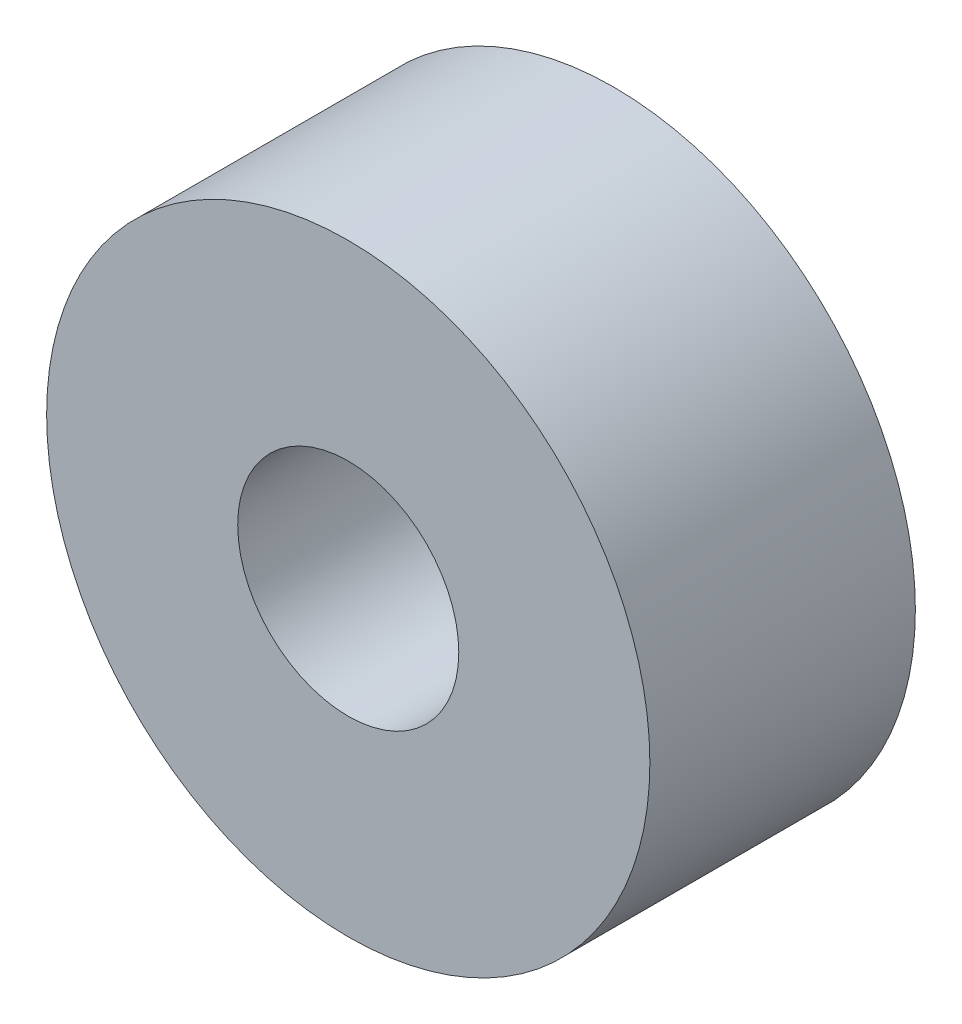
ISO-10303-21;
HEADER;
FILE_DESCRIPTION(('STEP AP214'),'2;1');
FILE_NAME('part.step','',(''),(''),'','','');
FILE_SCHEMA(('AUTOMOTIVE_DESIGN { 1 0 10303 214 1 1 1 1 }'));
ENDSEC;
DATA;
#1=APPLICATION_CONTEXT('core data for automotive mechanical design processes');
#2=APPLICATION_PROTOCOL_DEFINITION('international standard','automotive_design',2000,#1);
#3=PRODUCT_CONTEXT('',#1,'mechanical');
#4=PRODUCT('Part','Part','',(#3));
#5=PRODUCT_RELATED_PRODUCT_CATEGORY('part','',(#4));
#6=PRODUCT_DEFINITION_FORMATION('','',#4);
#7=PRODUCT_DEFINITION_CONTEXT('part definition',#1,'design');
#8=PRODUCT_DEFINITION('design','',#6,#7);
#9=PRODUCT_DEFINITION_SHAPE('','',#8);
#10=(LENGTH_UNIT() NAMED_UNIT(*) SI_UNIT(.MILLI.,.METRE.));
#11=(NAMED_UNIT(*) PLANE_ANGLE_UNIT() SI_UNIT($,.RADIAN.));
#12=(NAMED_UNIT(*) SI_UNIT($,.STERADIAN.) SOLID_ANGLE_UNIT());
#13=UNCERTAINTY_MEASURE_WITH_UNIT(LENGTH_MEASURE(1.E-05),#10,'distance_accuracy_value','');
#14=(GEOMETRIC_REPRESENTATION_CONTEXT(3) GLOBAL_UNCERTAINTY_ASSIGNED_CONTEXT((#13)) GLOBAL_UNIT_ASSIGNED_CONTEXT((#10,
#11,#12)) REPRESENTATION_CONTEXT('',''));
#15=CARTESIAN_POINT('',(0.,0.,0.));
#16=DIRECTION('',(0.,0.,1.));
#17=DIRECTION('',(1.,0.,0.));
#18=AXIS2_PLACEMENT_3D('',#15,#16,#17);
#19=CARTESIAN_POINT('',(0.,0.,7.35));
#20=DIRECTION('',(0.,0.,-1.));
#21=DIRECTION('',(-1.,0.,0.));
#22=AXIS2_PLACEMENT_3D('',#19,#20,#21);
#23=CYLINDRICAL_SURFACE('',#22,8.35);
#24=CARTESIAN_POINT('',(0.,0.,7.35));
#25=DIRECTION('',(0.,0.,1.));
#26=DIRECTION('',(1.,0.,0.));
#27=AXIS2_PLACEMENT_3D('',#24,#25,#26);
#28=CIRCLE('',#27,8.35);
#29=CARTESIAN_POINT('',(8.35,0.,7.35));
#30=VERTEX_POINT('',#29);
#31=EDGE_CURVE('E10',#30,#30,#28,.T.);
#32=ORIENTED_EDGE('',*,*,#31,.F.);
#33=EDGE_LOOP('',(#32));
#34=FACE_BOUND('',#33,.T.);
#35=CARTESIAN_POINT('',(0.,0.,0.));
#36=DIRECTION('',(0.,0.,1.));
#37=DIRECTION('',(1.,0.,0.));
#38=AXIS2_PLACEMENT_3D('',#35,#36,#37);
#39=CIRCLE('',#38,8.35);
#40=CARTESIAN_POINT('',(8.35,0.,0.));
#41=VERTEX_POINT('',#40);
#42=EDGE_CURVE('E36',#41,#41,#39,.T.);
#43=ORIENTED_EDGE('',*,*,#42,.T.);
#44=EDGE_LOOP('',(#43));
#45=FACE_BOUND('',#44,.T.);
#46=ADVANCED_FACE('F33',(#34,#45),#23,.T.);
#47=CARTESIAN_POINT('',(0.,0.,7.35));
#48=DIRECTION('',(0.,0.,1.));
#49=DIRECTION('',(1.,0.,0.));
#50=AXIS2_PLACEMENT_3D('',#47,#48,#49);
#51=PLANE('',#50);
#52=CARTESIAN_POINT('',(0.,0.,7.35));
#53=DIRECTION('',(0.,0.,1.));
#54=DIRECTION('',(1.,0.,0.));
#55=AXIS2_PLACEMENT_3D('',#52,#53,#54);
#56=CIRCLE('',#55,3.06);
#57=CARTESIAN_POINT('',(3.06,0.,7.35));
#58=VERTEX_POINT('',#57);
#59=EDGE_CURVE('E45',#58,#58,#56,.T.);
#60=ORIENTED_EDGE('',*,*,#59,.F.);
#61=EDGE_LOOP('',(#60));
#62=FACE_BOUND('',#61,.T.);
#63=ORIENTED_EDGE('',*,*,#31,.T.);
#64=EDGE_LOOP('',(#63));
#65=FACE_BOUND('',#64,.T.);
#66=ADVANCED_FACE('F60',(#62,#65),#51,.T.);
#67=CARTESIAN_POINT('',(0.,0.,0.));
#68=DIRECTION('',(0.,0.,1.));
#69=DIRECTION('',(1.,0.,0.));
#70=AXIS2_PLACEMENT_3D('',#67,#68,#69);
#71=PLANE('',#70);
#72=CARTESIAN_POINT('',(0.,0.,0.));
#73=DIRECTION('',(0.,0.,1.));
#74=DIRECTION('',(1.,0.,0.));
#75=AXIS2_PLACEMENT_3D('',#72,#73,#74);
#76=CIRCLE('',#75,3.06);
#77=CARTESIAN_POINT('',(3.06,0.,0.));
#78=VERTEX_POINT('',#77);
#79=EDGE_CURVE('E43',#78,#78,#76,.T.);
#80=ORIENTED_EDGE('',*,*,#79,.T.);
#81=EDGE_LOOP('',(#80));
#82=FACE_BOUND('',#81,.T.);
#83=ORIENTED_EDGE('',*,*,#42,.F.);
#84=EDGE_LOOP('',(#83));
#85=FACE_BOUND('',#84,.T.);
#86=ADVANCED_FACE('F51',(#82,#85),#71,.F.);
#87=CARTESIAN_POINT('',(0.,0.,0.));
#88=DIRECTION('',(0.,0.,1.));
#89=DIRECTION('',(1.,0.,0.));
#90=AXIS2_PLACEMENT_3D('',#87,#88,#89);
#91=CYLINDRICAL_SURFACE('',#90,3.06);
#92=ORIENTED_EDGE('',*,*,#79,.F.);
#93=EDGE_LOOP('',(#92));
#94=FACE_BOUND('',#93,.T.);
#95=ORIENTED_EDGE('',*,*,#59,.T.);
#96=EDGE_LOOP('',(#95));
#97=FACE_BOUND('',#96,.T.);
#98=ADVANCED_FACE('F54',(#94,#97),#91,.F.);
#99=CLOSED_SHELL('',(#46,#66,#86,#98));
#100=MANIFOLD_SOLID_BREP('B2',#99);
#101=ADVANCED_BREP_SHAPE_REPRESENTATION('',(#18,#100),#14);
#102=SHAPE_DEFINITION_REPRESENTATION(#9,#101);
ENDSEC;
END-ISO-10303-21;
